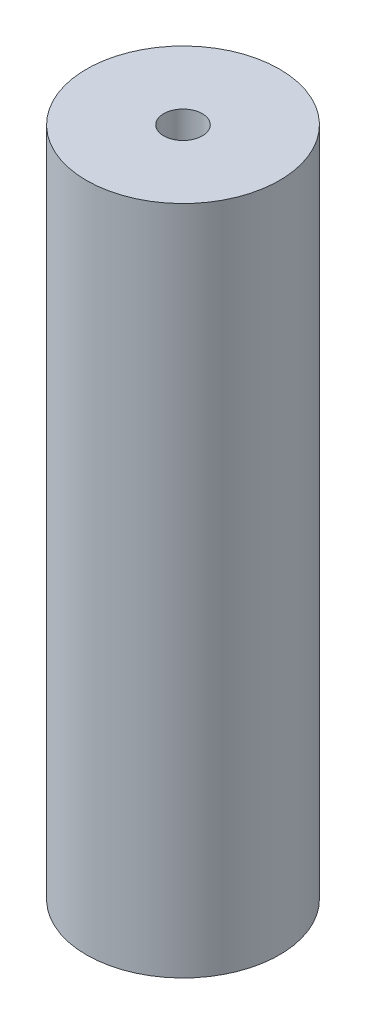
ISO-10303-21;
HEADER;
FILE_DESCRIPTION(('STEP AP214'),'2;1');
FILE_NAME('part.step','',(''),(''),'','','');
FILE_SCHEMA(('AUTOMOTIVE_DESIGN { 1 0 10303 214 1 1 1 1 }'));
ENDSEC;
DATA;
#1=APPLICATION_CONTEXT('core data for automotive mechanical design processes');
#2=APPLICATION_PROTOCOL_DEFINITION('international standard','automotive_design',2000,#1);
#3=PRODUCT_CONTEXT('',#1,'mechanical');
#4=PRODUCT('Part','Part','',(#3));
#5=PRODUCT_RELATED_PRODUCT_CATEGORY('part','',(#4));
#6=PRODUCT_DEFINITION_FORMATION('','',#4);
#7=PRODUCT_DEFINITION_CONTEXT('part definition',#1,'design');
#8=PRODUCT_DEFINITION('design','',#6,#7);
#9=PRODUCT_DEFINITION_SHAPE('','',#8);
#10=(LENGTH_UNIT() NAMED_UNIT(*) SI_UNIT(.MILLI.,.METRE.));
#11=(NAMED_UNIT(*) PLANE_ANGLE_UNIT() SI_UNIT($,.RADIAN.));
#12=(NAMED_UNIT(*) SI_UNIT($,.STERADIAN.) SOLID_ANGLE_UNIT());
#13=UNCERTAINTY_MEASURE_WITH_UNIT(LENGTH_MEASURE(1.E-05),#10,'distance_accuracy_value','');
#14=(GEOMETRIC_REPRESENTATION_CONTEXT(3) GLOBAL_UNCERTAINTY_ASSIGNED_CONTEXT((#13)) GLOBAL_UNIT_ASSIGNED_CONTEXT((#10,
#11,#12)) REPRESENTATION_CONTEXT('',''));
#15=CARTESIAN_POINT('',(0.,0.,0.));
#16=DIRECTION('',(0.,0.,1.));
#17=DIRECTION('',(1.,0.,0.));
#18=AXIS2_PLACEMENT_3D('',#15,#16,#17);
#19=CARTESIAN_POINT('',(0.,-139.,0.));
#20=DIRECTION('',(0.,1.,0.));
#21=DIRECTION('',(0.,0.,1.));
#22=AXIS2_PLACEMENT_3D('',#19,#20,#21);
#23=CYLINDRICAL_SURFACE('',#22,20.);
#24=CARTESIAN_POINT('',(0.,-139.,0.));
#25=DIRECTION('',(0.,1.,0.));
#26=DIRECTION('',(0.,0.,1.));
#27=AXIS2_PLACEMENT_3D('',#24,#25,#26);
#28=CIRCLE('',#27,20.);
#29=CARTESIAN_POINT('',(0.,-139.,20.));
#30=VERTEX_POINT('',#29);
#31=EDGE_CURVE('E10',#30,#30,#28,.T.);
#32=ORIENTED_EDGE('',*,*,#31,.T.);
#33=EDGE_LOOP('',(#32));
#34=FACE_BOUND('',#33,.T.);
#35=CARTESIAN_POINT('',(0.,0.,0.));
#36=DIRECTION('',(0.,1.,0.));
#37=DIRECTION('',(0.,0.,1.));
#38=AXIS2_PLACEMENT_3D('',#35,#36,#37);
#39=CIRCLE('',#38,20.);
#40=CARTESIAN_POINT('',(0.,0.,20.));
#41=VERTEX_POINT('',#40);
#42=EDGE_CURVE('E38',#41,#41,#39,.T.);
#43=ORIENTED_EDGE('',*,*,#42,.F.);
#44=EDGE_LOOP('',(#43));
#45=FACE_BOUND('',#44,.T.);
#46=ADVANCED_FACE('F35',(#34,#45),#23,.T.);
#47=CARTESIAN_POINT('',(0.,-139.,0.));
#48=DIRECTION('',(0.,1.,0.));
#49=DIRECTION('',(0.,0.,1.));
#50=AXIS2_PLACEMENT_3D('',#47,#48,#49);
#51=PLANE('',#50);
#52=CARTESIAN_POINT('',(0.,-139.,0.));
#53=DIRECTION('',(0.,1.,0.));
#54=DIRECTION('',(0.,0.,1.));
#55=AXIS2_PLACEMENT_3D('',#52,#53,#54);
#56=CIRCLE('',#55,4.);
#57=CARTESIAN_POINT('',(0.,-139.,4.));
#58=VERTEX_POINT('',#57);
#59=EDGE_CURVE('E45',#58,#58,#56,.T.);
#60=ORIENTED_EDGE('',*,*,#59,.T.);
#61=EDGE_LOOP('',(#60));
#62=FACE_BOUND('',#61,.T.);
#63=ORIENTED_EDGE('',*,*,#31,.F.);
#64=EDGE_LOOP('',(#63));
#65=FACE_BOUND('',#64,.T.);
#66=ADVANCED_FACE('F53',(#62,#65),#51,.F.);
#67=CARTESIAN_POINT('',(0.,0.,0.));
#68=DIRECTION('',(0.,1.,0.));
#69=DIRECTION('',(0.,0.,1.));
#70=AXIS2_PLACEMENT_3D('',#67,#68,#69);
#71=PLANE('',#70);
#72=CARTESIAN_POINT('',(0.,0.,0.));
#73=DIRECTION('',(0.,1.,0.));
#74=DIRECTION('',(0.,0.,1.));
#75=AXIS2_PLACEMENT_3D('',#72,#73,#74);
#76=CIRCLE('',#75,4.);
#77=CARTESIAN_POINT('',(0.,0.,4.));
#78=VERTEX_POINT('',#77);
#79=EDGE_CURVE('E47',#78,#78,#76,.T.);
#80=ORIENTED_EDGE('',*,*,#79,.F.);
#81=EDGE_LOOP('',(#80));
#82=FACE_BOUND('',#81,.T.);
#83=ORIENTED_EDGE('',*,*,#42,.T.);
#84=EDGE_LOOP('',(#83));
#85=FACE_BOUND('',#84,.T.);
#86=ADVANCED_FACE('F59',(#82,#85),#71,.T.);
#87=CARTESIAN_POINT('',(0.,-139.,0.));
#88=DIRECTION('',(0.,1.,0.));
#89=DIRECTION('',(0.,0.,1.));
#90=AXIS2_PLACEMENT_3D('',#87,#88,#89);
#91=CYLINDRICAL_SURFACE('',#90,4.);
#92=ORIENTED_EDGE('',*,*,#59,.F.);
#93=EDGE_LOOP('',(#92));
#94=FACE_BOUND('',#93,.T.);
#95=ORIENTED_EDGE('',*,*,#79,.T.);
#96=EDGE_LOOP('',(#95));
#97=FACE_BOUND('',#96,.T.);
#98=ADVANCED_FACE('F56',(#94,#97),#91,.F.);
#99=CLOSED_SHELL('',(#46,#66,#86,#98));
#100=MANIFOLD_SOLID_BREP('B2',#99);
#101=ADVANCED_BREP_SHAPE_REPRESENTATION('',(#18,#100),#14);
#102=SHAPE_DEFINITION_REPRESENTATION(#9,#101);
ENDSEC;
END-ISO-10303-21;
